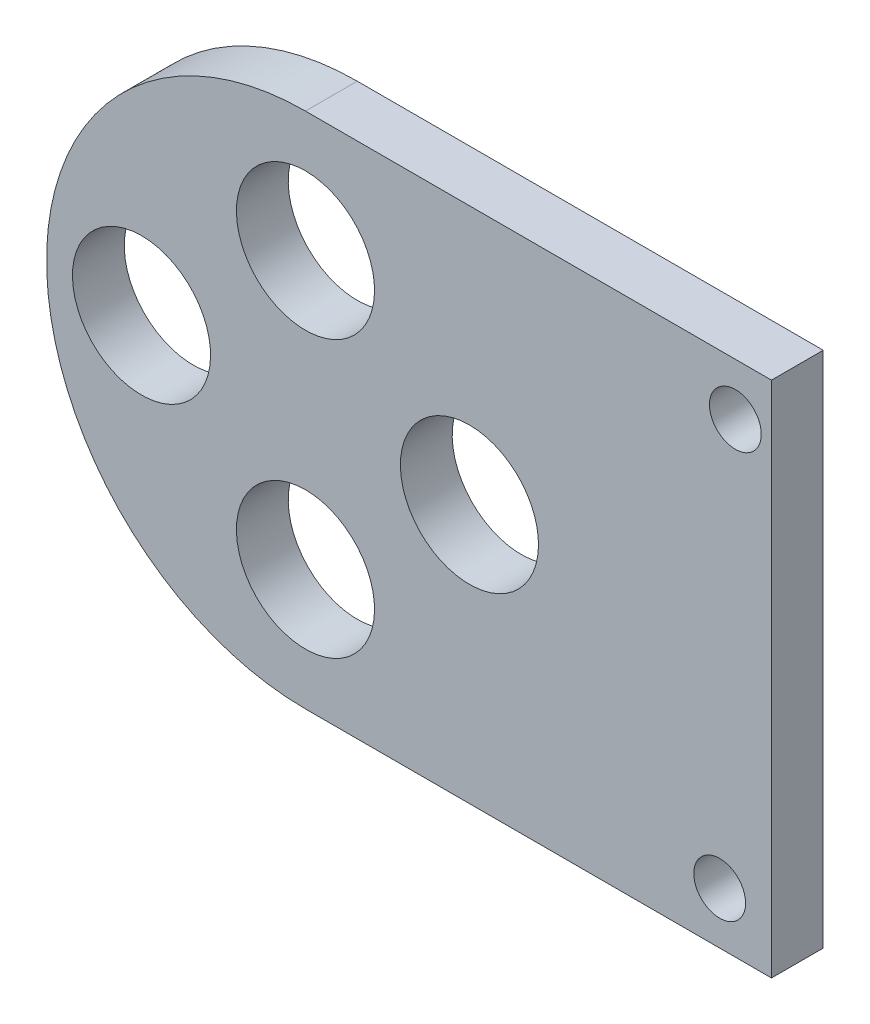
ISO-10303-21;
HEADER;
FILE_DESCRIPTION(('STEP AP214'),'2;1');
FILE_NAME('part.step','',(''),(''),'','','');
FILE_SCHEMA(('AUTOMOTIVE_DESIGN { 1 0 10303 214 1 1 1 1 }'));
ENDSEC;
DATA;
#1=APPLICATION_CONTEXT('core data for automotive mechanical design processes');
#2=APPLICATION_PROTOCOL_DEFINITION('international standard','automotive_design',2000,#1);
#3=PRODUCT_CONTEXT('',#1,'mechanical');
#4=PRODUCT('Part','Part','',(#3));
#5=PRODUCT_RELATED_PRODUCT_CATEGORY('part','',(#4));
#6=PRODUCT_DEFINITION_FORMATION('','',#4);
#7=PRODUCT_DEFINITION_CONTEXT('part definition',#1,'design');
#8=PRODUCT_DEFINITION('design','',#6,#7);
#9=PRODUCT_DEFINITION_SHAPE('','',#8);
#10=(LENGTH_UNIT() NAMED_UNIT(*) SI_UNIT(.MILLI.,.METRE.));
#11=(NAMED_UNIT(*) PLANE_ANGLE_UNIT() SI_UNIT($,.RADIAN.));
#12=(NAMED_UNIT(*) SI_UNIT($,.STERADIAN.) SOLID_ANGLE_UNIT());
#13=UNCERTAINTY_MEASURE_WITH_UNIT(LENGTH_MEASURE(1.E-05),#10,'distance_accuracy_value','');
#14=(GEOMETRIC_REPRESENTATION_CONTEXT(3) GLOBAL_UNCERTAINTY_ASSIGNED_CONTEXT((#13)) GLOBAL_UNIT_ASSIGNED_CONTEXT((#10,
#11,#12)) REPRESENTATION_CONTEXT('',''));
#15=CARTESIAN_POINT('',(0.,0.,0.));
#16=DIRECTION('',(0.,0.,1.));
#17=DIRECTION('',(1.,0.,0.));
#18=AXIS2_PLACEMENT_3D('',#15,#16,#17);
#19=CARTESIAN_POINT('',(-273.,652.332012286223,-404.357743681072));
#20=DIRECTION('',(0.,0.,-1.));
#21=DIRECTION('',(-1.,0.,0.));
#22=AXIS2_PLACEMENT_3D('',#19,#20,#21);
#23=PLANE('',#22);
#24=CARTESIAN_POINT('',(-309.5,667.332012286223,-404.357743681072));
#25=DIRECTION('',(0.,0.,-1.));
#26=DIRECTION('',(0.,1.,0.));
#27=AXIS2_PLACEMENT_3D('',#24,#25,#26);
#28=CIRCLE('',#27,4.);
#29=CARTESIAN_POINT('',(-309.5,671.332012286223,-404.357743681072));
#30=VERTEX_POINT('',#29);
#31=EDGE_CURVE('E129',#30,#30,#28,.F.);
#32=ORIENTED_EDGE('',*,*,#31,.T.);
#33=EDGE_LOOP('',(#32));
#34=FACE_BOUND('',#33,.T.);
#35=CARTESIAN_POINT('',(-300.000000000001,675.332012286223,-404.357743681072));
#36=DIRECTION('',(0.,0.,-1.));
#37=DIRECTION('',(0.,1.,0.));
#38=AXIS2_PLACEMENT_3D('',#35,#36,#37);
#39=CIRCLE('',#38,4.);
#40=CARTESIAN_POINT('',(-300.000000000001,679.332012286223,-404.357743681072));
#41=VERTEX_POINT('',#40);
#42=EDGE_CURVE('E126',#41,#41,#39,.F.);
#43=ORIENTED_EDGE('',*,*,#42,.T.);
#44=EDGE_LOOP('',(#43));
#45=FACE_BOUND('',#44,.T.);
#46=CARTESIAN_POINT('',(-300.000000000001,659.332012286223,-404.357743681072));
#47=DIRECTION('',(0.,0.,-1.));
#48=DIRECTION('',(0.,1.,0.));
#49=AXIS2_PLACEMENT_3D('',#46,#47,#48);
#50=CIRCLE('',#49,4.);
#51=CARTESIAN_POINT('',(-300.000000000001,663.332012286223,-404.357743681072));
#52=VERTEX_POINT('',#51);
#53=EDGE_CURVE('E85',#52,#52,#50,.F.);
#54=ORIENTED_EDGE('',*,*,#53,.T.);
#55=EDGE_LOOP('',(#54));
#56=FACE_BOUND('',#55,.T.);
#57=CARTESIAN_POINT('',(-290.5,667.332012286223,-404.357743681072));
#58=DIRECTION('',(0.,0.,-1.));
#59=DIRECTION('',(0.,1.,0.));
#60=AXIS2_PLACEMENT_3D('',#57,#58,#59);
#61=CIRCLE('',#60,4.);
#62=CARTESIAN_POINT('',(-290.5,671.332012286223,-404.357743681072));
#63=VERTEX_POINT('',#62);
#64=EDGE_CURVE('E82',#63,#63,#61,.F.);
#65=ORIENTED_EDGE('',*,*,#64,.T.);
#66=EDGE_LOOP('',(#65));
#67=FACE_BOUND('',#66,.T.);
#68=CARTESIAN_POINT('',(-276.,655.332012286222,-404.357743681072));
#69=DIRECTION('',(0.,0.,-1.));
#70=DIRECTION('',(0.,1.,0.));
#71=AXIS2_PLACEMENT_3D('',#68,#69,#70);
#72=CIRCLE('',#71,1.5);
#73=CARTESIAN_POINT('',(-276.,656.832012286222,-404.357743681072));
#74=VERTEX_POINT('',#73);
#75=EDGE_CURVE('E99',#74,#74,#72,.F.);
#76=ORIENTED_EDGE('',*,*,#75,.T.);
#77=EDGE_LOOP('',(#76));
#78=FACE_BOUND('',#77,.T.);
#79=CARTESIAN_POINT('',(-275.09203088991,679.314830971587,-404.357743681072));
#80=DIRECTION('',(0.,0.,-1.));
#81=DIRECTION('',(0.,1.,0.));
#82=AXIS2_PLACEMENT_3D('',#79,#80,#81);
#83=CIRCLE('',#82,1.5);
#84=CARTESIAN_POINT('',(-275.09203088991,680.814830971587,-404.357743681072));
#85=VERTEX_POINT('',#84);
#86=EDGE_CURVE('E132',#85,#85,#83,.F.);
#87=ORIENTED_EDGE('',*,*,#86,.T.);
#88=EDGE_LOOP('',(#87));
#89=FACE_BOUND('',#88,.T.);
#90=DIRECTION('',(1.,0.,0.));
#91=VECTOR('',#90,1.);
#92=CARTESIAN_POINT('',(-300.000000000001,682.332012286223,-404.357743681072));
#93=LINE('',#92,#91);
#94=CARTESIAN_POINT('',(-300.000000000001,682.332012286223,-404.357743681072));
#95=VERTEX_POINT('',#94);
#96=CARTESIAN_POINT('',(-273.,682.332012286223,-404.357743681072));
#97=VERTEX_POINT('',#96);
#98=EDGE_CURVE('E97',#95,#97,#93,.T.);
#99=ORIENTED_EDGE('',*,*,#98,.T.);
#100=DIRECTION('',(0.,-1.,0.));
#101=VECTOR('',#100,1.);
#102=CARTESIAN_POINT('',(-273.,652.332012286223,-404.357743681072));
#103=LINE('',#102,#101);
#104=CARTESIAN_POINT('',(-273.,652.332012286223,-404.357743681072));
#105=VERTEX_POINT('',#104);
#106=EDGE_CURVE('E56',#97,#105,#103,.T.);
#107=ORIENTED_EDGE('',*,*,#106,.T.);
#108=DIRECTION('',(1.,0.,0.));
#109=VECTOR('',#108,1.);
#110=CARTESIAN_POINT('',(-300.000000000001,652.332012286223,-404.357743681072));
#111=LINE('',#110,#109);
#112=CARTESIAN_POINT('',(-300.000000000001,652.332012286223,-404.357743681072));
#113=VERTEX_POINT('',#112);
#114=EDGE_CURVE('E70',#105,#113,#111,.F.);
#115=ORIENTED_EDGE('',*,*,#114,.T.);
#116=CARTESIAN_POINT('',(-300.000000000001,667.332012286223,-404.357743681072));
#117=DIRECTION('',(0.,0.,1.));
#118=DIRECTION('',(1.,0.,0.));
#119=AXIS2_PLACEMENT_3D('',#116,#117,#118);
#120=CIRCLE('',#119,15.);
#121=EDGE_CURVE('E20',#95,#113,#120,.T.);
#122=ORIENTED_EDGE('',*,*,#121,.F.);
#123=EDGE_LOOP('',(#99,#107,#115,#122));
#124=FACE_BOUND('',#123,.T.);
#125=ADVANCED_FACE('F17',(#34,#45,#56,#67,#78,#89,#124),#23,.T.);
#126=CARTESIAN_POINT('',(-273.,652.332012286223,-404.357743681072));
#127=DIRECTION('',(-1.,0.,0.));
#128=DIRECTION('',(0.,-1.,0.));
#129=AXIS2_PLACEMENT_3D('',#126,#127,#128);
#130=PLANE('',#129);
#131=ORIENTED_EDGE('',*,*,#106,.F.);
#132=DIRECTION('',(0.,0.,-1.));
#133=VECTOR('',#132,1.);
#134=CARTESIAN_POINT('',(-273.,682.332012286223,-401.357743681072));
#135=LINE('',#134,#133);
#136=CARTESIAN_POINT('',(-273.,682.332012286223,-401.357743681072));
#137=VERTEX_POINT('',#136);
#138=EDGE_CURVE('E81',#97,#137,#135,.F.);
#139=ORIENTED_EDGE('',*,*,#138,.T.);
#140=DIRECTION('',(0.,1.,0.));
#141=VECTOR('',#140,1.);
#142=CARTESIAN_POINT('',(-273.,652.332012286223,-401.357743681072));
#143=LINE('',#142,#141);
#144=CARTESIAN_POINT('',(-273.,652.332012286223,-401.357743681072));
#145=VERTEX_POINT('',#144);
#146=EDGE_CURVE('E76',#137,#145,#143,.F.);
#147=ORIENTED_EDGE('',*,*,#146,.T.);
#148=DIRECTION('',(0.,0.,1.));
#149=VECTOR('',#148,1.);
#150=CARTESIAN_POINT('',(-273.,652.332012286223,-404.357743681072));
#151=LINE('',#150,#149);
#152=EDGE_CURVE('E65',#145,#105,#151,.F.);
#153=ORIENTED_EDGE('',*,*,#152,.T.);
#154=EDGE_LOOP('',(#131,#139,#147,#153));
#155=FACE_BOUND('',#154,.T.);
#156=ADVANCED_FACE('F80',(#155),#130,.F.);
#157=CARTESIAN_POINT('',(-300.000000000001,652.332012286223,-404.357743681072));
#158=DIRECTION('',(0.,1.,0.));
#159=DIRECTION('',(0.,0.,1.));
#160=AXIS2_PLACEMENT_3D('',#157,#158,#159);
#161=PLANE('',#160);
#162=DIRECTION('',(0.,0.,1.));
#163=VECTOR('',#162,1.);
#164=CARTESIAN_POINT('',(-300.000000000001,652.332012286223,-402.857743681072));
#165=LINE('',#164,#163);
#166=CARTESIAN_POINT('',(-300.000000000001,652.332012286223,-401.357743681072));
#167=VERTEX_POINT('',#166);
#168=EDGE_CURVE('E93',#113,#167,#165,.T.);
#169=ORIENTED_EDGE('',*,*,#168,.F.);
#170=ORIENTED_EDGE('',*,*,#114,.F.);
#171=ORIENTED_EDGE('',*,*,#152,.F.);
#172=DIRECTION('',(-1.,0.,0.));
#173=VECTOR('',#172,1.);
#174=CARTESIAN_POINT('',(-273.,652.332012286223,-401.357743681072));
#175=LINE('',#174,#173);
#176=EDGE_CURVE('E69',#145,#167,#175,.T.);
#177=ORIENTED_EDGE('',*,*,#176,.T.);
#178=EDGE_LOOP('',(#169,#170,#171,#177));
#179=FACE_BOUND('',#178,.T.);
#180=ADVANCED_FACE('F68',(#179),#161,.F.);
#181=CARTESIAN_POINT('',(-300.000000000001,667.332012286223,-402.857743681072));
#182=DIRECTION('',(0.,0.,1.));
#183=DIRECTION('',(1.,0.,0.));
#184=AXIS2_PLACEMENT_3D('',#181,#182,#183);
#185=CYLINDRICAL_SURFACE('',#184,15.);
#186=ORIENTED_EDGE('',*,*,#121,.T.);
#187=ORIENTED_EDGE('',*,*,#168,.T.);
#188=CARTESIAN_POINT('',(-300.000000000001,667.332012286223,-401.357743681072));
#189=DIRECTION('',(0.,0.,1.));
#190=DIRECTION('',(1.,0.,0.));
#191=AXIS2_PLACEMENT_3D('',#188,#189,#190);
#192=CIRCLE('',#191,15.);
#193=CARTESIAN_POINT('',(-300.000000000001,682.332012286223,-401.357743681072));
#194=VERTEX_POINT('',#193);
#195=EDGE_CURVE('E78',#167,#194,#192,.F.);
#196=ORIENTED_EDGE('',*,*,#195,.T.);
#197=DIRECTION('',(0.,0.,-1.));
#198=VECTOR('',#197,1.);
#199=CARTESIAN_POINT('',(-300.000000000001,682.332012286223,-401.357743681072));
#200=LINE('',#199,#198);
#201=EDGE_CURVE('E35',#194,#95,#200,.T.);
#202=ORIENTED_EDGE('',*,*,#201,.T.);
#203=EDGE_LOOP('',(#186,#187,#196,#202));
#204=FACE_BOUND('',#203,.T.);
#205=ADVANCED_FACE('F177',(#204),#185,.T.);
#206=CARTESIAN_POINT('',(-300.000000000001,682.332012286223,-401.357743681072));
#207=DIRECTION('',(0.,-1.,0.));
#208=DIRECTION('',(0.,0.,-1.));
#209=AXIS2_PLACEMENT_3D('',#206,#207,#208);
#210=PLANE('',#209);
#211=ORIENTED_EDGE('',*,*,#201,.F.);
#212=DIRECTION('',(-1.,0.,0.));
#213=VECTOR('',#212,1.);
#214=CARTESIAN_POINT('',(-273.,682.332012286223,-401.357743681072));
#215=LINE('',#214,#213);
#216=EDGE_CURVE('E122',#194,#137,#215,.F.);
#217=ORIENTED_EDGE('',*,*,#216,.T.);
#218=ORIENTED_EDGE('',*,*,#138,.F.);
#219=ORIENTED_EDGE('',*,*,#98,.F.);
#220=EDGE_LOOP('',(#211,#217,#218,#219));
#221=FACE_BOUND('',#220,.T.);
#222=ADVANCED_FACE('F143',(#221),#210,.F.);
#223=CARTESIAN_POINT('',(-276.,655.332012286222,-404.659227586513));
#224=DIRECTION('',(0.,0.,-1.));
#225=DIRECTION('',(0.,1.,0.));
#226=AXIS2_PLACEMENT_3D('',#223,#224,#225);
#227=CYLINDRICAL_SURFACE('',#226,1.5);
#228=ORIENTED_EDGE('',*,*,#75,.F.);
#229=EDGE_LOOP('',(#228));
#230=FACE_BOUND('',#229,.T.);
#231=CARTESIAN_POINT('',(-276.,655.332012286222,-401.357743681072));
#232=DIRECTION('',(0.,0.,-1.));
#233=DIRECTION('',(0.,1.,0.));
#234=AXIS2_PLACEMENT_3D('',#231,#232,#233);
#235=CIRCLE('',#234,1.5);
#236=CARTESIAN_POINT('',(-276.,656.832012286222,-401.357743681072));
#237=VERTEX_POINT('',#236);
#238=EDGE_CURVE('E119',#237,#237,#235,.F.);
#239=ORIENTED_EDGE('',*,*,#238,.T.);
#240=EDGE_LOOP('',(#239));
#241=FACE_BOUND('',#240,.T.);
#242=ADVANCED_FACE('F139',(#230,#241),#227,.F.);
#243=CARTESIAN_POINT('',(-275.09203088991,679.314830971587,-404.659227586513));
#244=DIRECTION('',(0.,0.,-1.));
#245=DIRECTION('',(0.,1.,0.));
#246=AXIS2_PLACEMENT_3D('',#243,#244,#245);
#247=CYLINDRICAL_SURFACE('',#246,1.5);
#248=ORIENTED_EDGE('',*,*,#86,.F.);
#249=EDGE_LOOP('',(#248));
#250=FACE_BOUND('',#249,.T.);
#251=CARTESIAN_POINT('',(-275.09203088991,679.314830971587,-401.357743681072));
#252=DIRECTION('',(0.,0.,-1.));
#253=DIRECTION('',(0.,1.,0.));
#254=AXIS2_PLACEMENT_3D('',#251,#252,#253);
#255=CIRCLE('',#254,1.5);
#256=CARTESIAN_POINT('',(-275.09203088991,680.814830971587,-401.357743681072));
#257=VERTEX_POINT('',#256);
#258=EDGE_CURVE('E116',#257,#257,#255,.F.);
#259=ORIENTED_EDGE('',*,*,#258,.T.);
#260=EDGE_LOOP('',(#259));
#261=FACE_BOUND('',#260,.T.);
#262=ADVANCED_FACE('F142',(#250,#261),#247,.F.);
#263=CARTESIAN_POINT('',(-309.5,667.332012286223,-403.607743681072));
#264=DIRECTION('',(0.,0.,-1.));
#265=DIRECTION('',(0.,1.,0.));
#266=AXIS2_PLACEMENT_3D('',#263,#264,#265);
#267=CYLINDRICAL_SURFACE('',#266,4.);
#268=CARTESIAN_POINT('',(-309.5,667.332012286223,-401.357743681072));
#269=DIRECTION('',(0.,0.,-1.));
#270=DIRECTION('',(0.,1.,0.));
#271=AXIS2_PLACEMENT_3D('',#268,#269,#270);
#272=CIRCLE('',#271,4.);
#273=CARTESIAN_POINT('',(-309.5,671.332012286223,-401.357743681072));
#274=VERTEX_POINT('',#273);
#275=EDGE_CURVE('E113',#274,#274,#272,.F.);
#276=ORIENTED_EDGE('',*,*,#275,.T.);
#277=EDGE_LOOP('',(#276));
#278=FACE_BOUND('',#277,.T.);
#279=ORIENTED_EDGE('',*,*,#31,.F.);
#280=EDGE_LOOP('',(#279));
#281=FACE_BOUND('',#280,.T.);
#282=ADVANCED_FACE('F167',(#278,#281),#267,.F.);
#283=CARTESIAN_POINT('',(-300.000000000001,675.332012286223,-403.607743681072));
#284=DIRECTION('',(0.,0.,-1.));
#285=DIRECTION('',(0.,1.,0.));
#286=AXIS2_PLACEMENT_3D('',#283,#284,#285);
#287=CYLINDRICAL_SURFACE('',#286,4.);
#288=CARTESIAN_POINT('',(-300.000000000001,675.332012286223,-401.357743681072));
#289=DIRECTION('',(0.,0.,-1.));
#290=DIRECTION('',(0.,1.,0.));
#291=AXIS2_PLACEMENT_3D('',#288,#289,#290);
#292=CIRCLE('',#291,4.);
#293=CARTESIAN_POINT('',(-300.000000000001,679.332012286223,-401.357743681072));
#294=VERTEX_POINT('',#293);
#295=EDGE_CURVE('E110',#294,#294,#292,.F.);
#296=ORIENTED_EDGE('',*,*,#295,.T.);
#297=EDGE_LOOP('',(#296));
#298=FACE_BOUND('',#297,.T.);
#299=ORIENTED_EDGE('',*,*,#42,.F.);
#300=EDGE_LOOP('',(#299));
#301=FACE_BOUND('',#300,.T.);
#302=ADVANCED_FACE('F163',(#298,#301),#287,.F.);
#303=CARTESIAN_POINT('',(-300.000000000001,659.332012286223,-403.607743681072));
#304=DIRECTION('',(0.,0.,-1.));
#305=DIRECTION('',(0.,1.,0.));
#306=AXIS2_PLACEMENT_3D('',#303,#304,#305);
#307=CYLINDRICAL_SURFACE('',#306,4.);
#308=CARTESIAN_POINT('',(-300.000000000001,659.332012286223,-401.357743681072));
#309=DIRECTION('',(0.,0.,-1.));
#310=DIRECTION('',(0.,1.,0.));
#311=AXIS2_PLACEMENT_3D('',#308,#309,#310);
#312=CIRCLE('',#311,4.);
#313=CARTESIAN_POINT('',(-300.000000000001,663.332012286223,-401.357743681072));
#314=VERTEX_POINT('',#313);
#315=EDGE_CURVE('E26',#314,#314,#312,.F.);
#316=ORIENTED_EDGE('',*,*,#315,.T.);
#317=EDGE_LOOP('',(#316));
#318=FACE_BOUND('',#317,.T.);
#319=ORIENTED_EDGE('',*,*,#53,.F.);
#320=EDGE_LOOP('',(#319));
#321=FACE_BOUND('',#320,.T.);
#322=ADVANCED_FACE('F155',(#318,#321),#307,.F.);
#323=CARTESIAN_POINT('',(-290.5,667.332012286223,-403.607743681072));
#324=DIRECTION('',(0.,0.,-1.));
#325=DIRECTION('',(0.,1.,0.));
#326=AXIS2_PLACEMENT_3D('',#323,#324,#325);
#327=CYLINDRICAL_SURFACE('',#326,4.);
#328=CARTESIAN_POINT('',(-290.5,667.332012286223,-401.357743681072));
#329=DIRECTION('',(0.,0.,-1.));
#330=DIRECTION('',(0.,1.,0.));
#331=AXIS2_PLACEMENT_3D('',#328,#329,#330);
#332=CIRCLE('',#331,4.);
#333=CARTESIAN_POINT('',(-290.5,671.332012286223,-401.357743681072));
#334=VERTEX_POINT('',#333);
#335=EDGE_CURVE('E11',#334,#334,#332,.F.);
#336=ORIENTED_EDGE('',*,*,#335,.T.);
#337=EDGE_LOOP('',(#336));
#338=FACE_BOUND('',#337,.T.);
#339=ORIENTED_EDGE('',*,*,#64,.F.);
#340=EDGE_LOOP('',(#339));
#341=FACE_BOUND('',#340,.T.);
#342=ADVANCED_FACE('F148',(#338,#341),#327,.F.);
#343=CARTESIAN_POINT('',(-273.,652.332012286223,-401.357743681072));
#344=DIRECTION('',(0.,0.,-1.));
#345=DIRECTION('',(-1.,0.,0.));
#346=AXIS2_PLACEMENT_3D('',#343,#344,#345);
#347=PLANE('',#346);
#348=ORIENTED_EDGE('',*,*,#335,.F.);
#349=EDGE_LOOP('',(#348));
#350=FACE_BOUND('',#349,.T.);
#351=ORIENTED_EDGE('',*,*,#315,.F.);
#352=EDGE_LOOP('',(#351));
#353=FACE_BOUND('',#352,.T.);
#354=ORIENTED_EDGE('',*,*,#295,.F.);
#355=EDGE_LOOP('',(#354));
#356=FACE_BOUND('',#355,.T.);
#357=ORIENTED_EDGE('',*,*,#275,.F.);
#358=EDGE_LOOP('',(#357));
#359=FACE_BOUND('',#358,.T.);
#360=ORIENTED_EDGE('',*,*,#258,.F.);
#361=EDGE_LOOP('',(#360));
#362=FACE_BOUND('',#361,.T.);
#363=ORIENTED_EDGE('',*,*,#238,.F.);
#364=EDGE_LOOP('',(#363));
#365=FACE_BOUND('',#364,.T.);
#366=ORIENTED_EDGE('',*,*,#195,.F.);
#367=ORIENTED_EDGE('',*,*,#176,.F.);
#368=ORIENTED_EDGE('',*,*,#146,.F.);
#369=ORIENTED_EDGE('',*,*,#216,.F.);
#370=EDGE_LOOP('',(#366,#367,#368,#369));
#371=FACE_BOUND('',#370,.T.);
#372=ADVANCED_FACE('F75',(#350,#353,#356,#359,#362,#365,#371),#347,.F.);
#373=CLOSED_SHELL('',(#125,#156,#180,#205,#222,#242,#262,#282,#302,#322,#342,#372));
#374=MANIFOLD_SOLID_BREP('B1',#373);
#375=ADVANCED_BREP_SHAPE_REPRESENTATION('',(#18,#374),#14);
#376=SHAPE_DEFINITION_REPRESENTATION(#9,#375);
ENDSEC;
END-ISO-10303-21;
